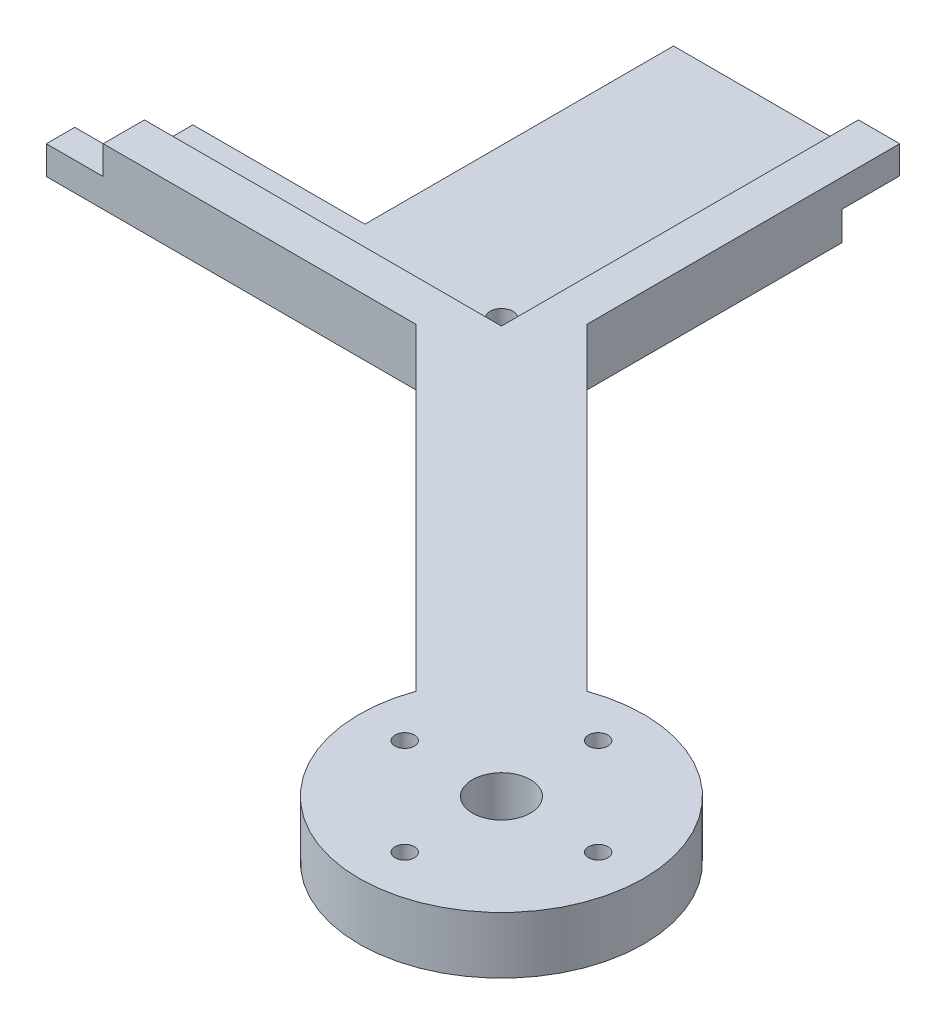
ISO-10303-21;
HEADER;
FILE_DESCRIPTION(('STEP AP214'),'2;1');
FILE_NAME('part.step','',(''),(''),'','','');
FILE_SCHEMA(('AUTOMOTIVE_DESIGN { 1 0 10303 214 1 1 1 1 }'));
ENDSEC;
DATA;
#1=APPLICATION_CONTEXT('core data for automotive mechanical design processes');
#2=APPLICATION_PROTOCOL_DEFINITION('international standard','automotive_design',2000,#1);
#3=PRODUCT_CONTEXT('',#1,'mechanical');
#4=PRODUCT('Part','Part','',(#3));
#5=PRODUCT_RELATED_PRODUCT_CATEGORY('part','',(#4));
#6=PRODUCT_DEFINITION_FORMATION('','',#4);
#7=PRODUCT_DEFINITION_CONTEXT('part definition',#1,'design');
#8=PRODUCT_DEFINITION('design','',#6,#7);
#9=PRODUCT_DEFINITION_SHAPE('','',#8);
#10=(LENGTH_UNIT() NAMED_UNIT(*) SI_UNIT(.MILLI.,.METRE.));
#11=(NAMED_UNIT(*) PLANE_ANGLE_UNIT() SI_UNIT($,.RADIAN.));
#12=(NAMED_UNIT(*) SI_UNIT($,.STERADIAN.) SOLID_ANGLE_UNIT());
#13=UNCERTAINTY_MEASURE_WITH_UNIT(LENGTH_MEASURE(1.E-05),#10,'distance_accuracy_value','');
#14=(GEOMETRIC_REPRESENTATION_CONTEXT(3) GLOBAL_UNCERTAINTY_ASSIGNED_CONTEXT((#13)) GLOBAL_UNIT_ASSIGNED_CONTEXT((#10,
#11,#12)) REPRESENTATION_CONTEXT('',''));
#15=CARTESIAN_POINT('',(0.,0.,0.));
#16=DIRECTION('',(0.,0.,1.));
#17=DIRECTION('',(1.,0.,0.));
#18=AXIS2_PLACEMENT_3D('',#15,#16,#17);
#19=CARTESIAN_POINT('',(-70.,-10.01,0.));
#20=DIRECTION('',(0.,0.,1.));
#21=DIRECTION('',(1.,0.,0.));
#22=AXIS2_PLACEMENT_3D('',#19,#20,#21);
#23=PLANE('',#22);
#24=DIRECTION('',(0.,-1.,0.));
#25=VECTOR('',#24,1.);
#26=CARTESIAN_POINT('',(70.,-10.,0.));
#27=LINE('',#26,#25);
#28=CARTESIAN_POINT('',(70.,0.,0.));
#29=VERTEX_POINT('',#28);
#30=CARTESIAN_POINT('',(70.,-4.9,0.));
#31=VERTEX_POINT('',#30);
#32=EDGE_CURVE('E326',#29,#31,#27,.T.);
#33=ORIENTED_EDGE('',*,*,#32,.T.);
#34=DIRECTION('',(1.,0.,0.));
#35=VECTOR('',#34,1.);
#36=CARTESIAN_POINT('',(70.,-4.9,0.));
#37=LINE('',#36,#35);
#38=CARTESIAN_POINT('',(64.9,-4.9,0.));
#39=VERTEX_POINT('',#38);
#40=EDGE_CURVE('E196',#39,#31,#37,.T.);
#41=ORIENTED_EDGE('',*,*,#40,.F.);
#42=DIRECTION('',(0.,1.,0.));
#43=VECTOR('',#42,1.);
#44=CARTESIAN_POINT('',(64.9,-10.,0.));
#45=LINE('',#44,#43);
#46=CARTESIAN_POINT('',(64.9,-10.,0.));
#47=VERTEX_POINT('',#46);
#48=EDGE_CURVE('E409',#47,#39,#45,.T.);
#49=ORIENTED_EDGE('',*,*,#48,.F.);
#50=DIRECTION('',(1.,0.,0.));
#51=VECTOR('',#50,1.);
#52=CARTESIAN_POINT('',(134.350288425444,-10.,0.));
#53=LINE('',#52,#51);
#54=CARTESIAN_POINT('',(40.35,-10.,0.));
#55=VERTEX_POINT('',#54);
#56=EDGE_CURVE('E337',#55,#47,#53,.T.);
#57=ORIENTED_EDGE('',*,*,#56,.F.);
#58=DIRECTION('',(0.,-1.,0.));
#59=VECTOR('',#58,1.);
#60=CARTESIAN_POINT('',(40.35,-10.,0.));
#61=LINE('',#60,#59);
#62=CARTESIAN_POINT('',(40.35,-7.4,0.));
#63=VERTEX_POINT('',#62);
#64=EDGE_CURVE('E430',#63,#55,#61,.T.);
#65=ORIENTED_EDGE('',*,*,#64,.F.);
#66=DIRECTION('',(1.,0.,0.));
#67=VECTOR('',#66,1.);
#68=CARTESIAN_POINT('',(30.25,-7.4,0.));
#69=LINE('',#68,#67);
#70=CARTESIAN_POINT('',(30.25,-7.4,0.));
#71=VERTEX_POINT('',#70);
#72=EDGE_CURVE('E440',#71,#63,#69,.T.);
#73=ORIENTED_EDGE('',*,*,#72,.F.);
#74=DIRECTION('',(0.,-1.,0.));
#75=VECTOR('',#74,1.);
#76=CARTESIAN_POINT('',(30.25,-10.,0.));
#77=LINE('',#76,#75);
#78=CARTESIAN_POINT('',(30.25,-5.,0.));
#79=VERTEX_POINT('',#78);
#80=EDGE_CURVE('E332',#79,#71,#77,.T.);
#81=ORIENTED_EDGE('',*,*,#80,.F.);
#82=DIRECTION('',(1.,0.,0.));
#83=VECTOR('',#82,1.);
#84=CARTESIAN_POINT('',(0.,-5.,0.));
#85=LINE('',#84,#83);
#86=CARTESIAN_POINT('',(62.75,-5.,0.));
#87=VERTEX_POINT('',#86);
#88=EDGE_CURVE('E43',#79,#87,#85,.T.);
#89=ORIENTED_EDGE('',*,*,#88,.T.);
#90=DIRECTION('',(0.,-1.,0.));
#91=VECTOR('',#90,1.);
#92=CARTESIAN_POINT('',(62.75,-5.,0.));
#93=LINE('',#92,#91);
#94=CARTESIAN_POINT('',(62.75,0.,0.));
#95=VERTEX_POINT('',#94);
#96=EDGE_CURVE('E345',#95,#87,#93,.T.);
#97=ORIENTED_EDGE('',*,*,#96,.F.);
#98=DIRECTION('',(1.,0.,0.));
#99=VECTOR('',#98,1.);
#100=CARTESIAN_POINT('',(134.350288425444,0.,0.));
#101=LINE('',#100,#99);
#102=EDGE_CURVE('E327',#95,#29,#101,.T.);
#103=ORIENTED_EDGE('',*,*,#102,.T.);
#104=EDGE_LOOP('',(#33,#41,#49,#57,#65,#73,#81,#89,#97,#103));
#105=FACE_BOUND('',#104,.T.);
#106=ADVANCED_FACE('F39',(#105),#23,.F.);
#107=CARTESIAN_POINT('',(0.,-10.01,-70.));
#108=DIRECTION('',(-1.,0.,0.));
#109=DIRECTION('',(0.,0.,1.));
#110=AXIS2_PLACEMENT_3D('',#107,#108,#109);
#111=PLANE('',#110);
#112=DIRECTION('',(0.,-1.,0.));
#113=VECTOR('',#112,1.);
#114=CARTESIAN_POINT('',(0.,-10.,65.));
#115=LINE('',#114,#113);
#116=CARTESIAN_POINT('',(0.,-5.,65.));
#117=VERTEX_POINT('',#116);
#118=CARTESIAN_POINT('',(0.,-10.,65.));
#119=VERTEX_POINT('',#118);
#120=EDGE_CURVE('E459',#117,#119,#115,.T.);
#121=ORIENTED_EDGE('',*,*,#120,.F.);
#122=DIRECTION('',(0.,0.,-1.));
#123=VECTOR('',#122,1.);
#124=CARTESIAN_POINT('',(0.,-5.,70.));
#125=LINE('',#124,#123);
#126=CARTESIAN_POINT('',(0.,-5.,70.));
#127=VERTEX_POINT('',#126);
#128=EDGE_CURVE('E420',#127,#117,#125,.T.);
#129=ORIENTED_EDGE('',*,*,#128,.F.);
#130=DIRECTION('',(0.,-1.,0.));
#131=VECTOR('',#130,1.);
#132=CARTESIAN_POINT('',(0.,-10.,70.));
#133=LINE('',#132,#131);
#134=CARTESIAN_POINT('',(0.,0.,70.));
#135=VERTEX_POINT('',#134);
#136=EDGE_CURVE('E333',#135,#127,#133,.T.);
#137=ORIENTED_EDGE('',*,*,#136,.F.);
#138=DIRECTION('',(0.,0.,1.));
#139=VECTOR('',#138,1.);
#140=CARTESIAN_POINT('',(0.,0.,-134.350288425444));
#141=LINE('',#140,#139);
#142=CARTESIAN_POINT('',(0.,0.,62.75));
#143=VERTEX_POINT('',#142);
#144=EDGE_CURVE('E338',#143,#135,#141,.T.);
#145=ORIENTED_EDGE('',*,*,#144,.F.);
#146=DIRECTION('',(0.,-1.,0.));
#147=VECTOR('',#146,1.);
#148=CARTESIAN_POINT('',(0.,-5.,62.75));
#149=LINE('',#148,#147);
#150=CARTESIAN_POINT('',(0.,-5.,62.75));
#151=VERTEX_POINT('',#150);
#152=EDGE_CURVE('E318',#143,#151,#149,.T.);
#153=ORIENTED_EDGE('',*,*,#152,.T.);
#154=DIRECTION('',(0.,0.,1.));
#155=VECTOR('',#154,1.);
#156=CARTESIAN_POINT('',(0.,-5.,0.));
#157=LINE('',#156,#155);
#158=CARTESIAN_POINT('',(0.,-5.,54.25));
#159=VERTEX_POINT('',#158);
#160=EDGE_CURVE('E341',#159,#151,#157,.T.);
#161=ORIENTED_EDGE('',*,*,#160,.F.);
#162=DIRECTION('',(0.,-1.,0.));
#163=VECTOR('',#162,1.);
#164=CARTESIAN_POINT('',(0.,-10.,54.25));
#165=LINE('',#164,#163);
#166=CARTESIAN_POINT('',(0.,-10.,54.25));
#167=VERTEX_POINT('',#166);
#168=EDGE_CURVE('E328',#159,#167,#165,.T.);
#169=ORIENTED_EDGE('',*,*,#168,.T.);
#170=DIRECTION('',(0.,0.,1.));
#171=VECTOR('',#170,1.);
#172=CARTESIAN_POINT('',(0.,-10.,-134.350288425444));
#173=LINE('',#172,#171);
#174=EDGE_CURVE('E323',#167,#119,#173,.T.);
#175=ORIENTED_EDGE('',*,*,#174,.T.);
#176=EDGE_LOOP('',(#121,#129,#137,#145,#153,#161,#169,#175));
#177=FACE_BOUND('',#176,.T.);
#178=ADVANCED_FACE('F504',(#177),#111,.T.);
#179=CARTESIAN_POINT('',(-30.25,-10.,54.25));
#180=DIRECTION('',(0.,0.,1.));
#181=DIRECTION('',(1.,0.,0.));
#182=AXIS2_PLACEMENT_3D('',#179,#180,#181);
#183=PLANE('',#182);
#184=ORIENTED_EDGE('',*,*,#168,.F.);
#185=DIRECTION('',(-1.,0.,0.));
#186=VECTOR('',#185,1.);
#187=CARTESIAN_POINT('',(-30.25,-5.,54.25));
#188=LINE('',#187,#186);
#189=CARTESIAN_POINT('',(30.25,-5.,54.25));
#190=VERTEX_POINT('',#189);
#191=EDGE_CURVE('E295',#190,#159,#188,.T.);
#192=ORIENTED_EDGE('',*,*,#191,.F.);
#193=DIRECTION('',(0.,1.,0.));
#194=VECTOR('',#193,1.);
#195=CARTESIAN_POINT('',(30.25,-10.,54.25));
#196=LINE('',#195,#194);
#197=CARTESIAN_POINT('',(30.25,-10.,54.25));
#198=VERTEX_POINT('',#197);
#199=EDGE_CURVE('E235',#198,#190,#196,.T.);
#200=ORIENTED_EDGE('',*,*,#199,.F.);
#201=DIRECTION('',(1.,0.,0.));
#202=VECTOR('',#201,1.);
#203=CARTESIAN_POINT('',(-30.25,-10.,54.25));
#204=LINE('',#203,#202);
#205=EDGE_CURVE('E239',#167,#198,#204,.T.);
#206=ORIENTED_EDGE('',*,*,#205,.F.);
#207=EDGE_LOOP('',(#184,#192,#200,#206));
#208=FACE_BOUND('',#207,.T.);
#209=ADVANCED_FACE('F501',(#208),#183,.F.);
#210=CARTESIAN_POINT('',(-55.,-10.,70.));
#211=DIRECTION('',(0.,0.,1.));
#212=DIRECTION('',(1.,0.,0.));
#213=AXIS2_PLACEMENT_3D('',#210,#211,#212);
#214=PLANE('',#213);
#215=DIRECTION('',(1.,0.,0.));
#216=VECTOR('',#215,1.);
#217=CARTESIAN_POINT('',(-55.,0.,70.));
#218=LINE('',#217,#216);
#219=CARTESIAN_POINT('',(55.,0.,70.));
#220=VERTEX_POINT('',#219);
#221=EDGE_CURVE('E240',#135,#220,#218,.T.);
#222=ORIENTED_EDGE('',*,*,#221,.F.);
#223=ORIENTED_EDGE('',*,*,#136,.T.);
#224=DIRECTION('',(1.,0.,0.));
#225=VECTOR('',#224,1.);
#226=CARTESIAN_POINT('',(-10.,-5.,70.));
#227=LINE('',#226,#225);
#228=CARTESIAN_POINT('',(-10.,-5.,70.));
#229=VERTEX_POINT('',#228);
#230=EDGE_CURVE('E322',#229,#127,#227,.T.);
#231=ORIENTED_EDGE('',*,*,#230,.F.);
#232=DIRECTION('',(0.,1.,0.));
#233=VECTOR('',#232,1.);
#234=CARTESIAN_POINT('',(-10.,-10.,70.));
#235=LINE('',#234,#233);
#236=CARTESIAN_POINT('',(-10.,-10.,70.));
#237=VERTEX_POINT('',#236);
#238=EDGE_CURVE('E454',#237,#229,#235,.T.);
#239=ORIENTED_EDGE('',*,*,#238,.F.);
#240=DIRECTION('',(1.,0.,0.));
#241=VECTOR('',#240,1.);
#242=CARTESIAN_POINT('',(-55.,-10.,70.));
#243=LINE('',#242,#241);
#244=CARTESIAN_POINT('',(55.,-10.,70.));
#245=VERTEX_POINT('',#244);
#246=EDGE_CURVE('E234',#237,#245,#243,.T.);
#247=ORIENTED_EDGE('',*,*,#246,.T.);
#248=DIRECTION('',(0.,1.,0.));
#249=VECTOR('',#248,1.);
#250=CARTESIAN_POINT('',(55.,-10.,70.));
#251=LINE('',#250,#249);
#252=EDGE_CURVE('E214',#245,#220,#251,.T.);
#253=ORIENTED_EDGE('',*,*,#252,.T.);
#254=EDGE_LOOP('',(#222,#223,#231,#239,#247,#253));
#255=FACE_BOUND('',#254,.T.);
#256=ADVANCED_FACE('F517',(#255),#214,.T.);
#257=CARTESIAN_POINT('',(134.350288425444,-10.,-134.350288425444));
#258=DIRECTION('',(0.,1.,0.));
#259=DIRECTION('',(0.,0.,1.));
#260=AXIS2_PLACEMENT_3D('',#257,#258,#259);
#261=PLANE('',#260);
#262=CARTESIAN_POINT('',(56.4999999999999,-10.,56.5));
#263=DIRECTION('',(0.,1.,0.));
#264=DIRECTION('',(0.,0.,1.));
#265=AXIS2_PLACEMENT_3D('',#262,#263,#264);
#266=CIRCLE('',#265,2.00000000000045);
#267=CARTESIAN_POINT('',(56.4999999999999,-10.,58.5000000000004));
#268=VERTEX_POINT('',#267);
#269=EDGE_CURVE('E245',#268,#268,#266,.T.);
#270=ORIENTED_EDGE('',*,*,#269,.T.);
#271=EDGE_LOOP('',(#270));
#272=FACE_BOUND('',#271,.T.);
#273=CARTESIAN_POINT('',(117.350288425444,-10.,134.350288425444));
#274=DIRECTION('',(0.,1.,0.));
#275=DIRECTION('',(0.,0.,1.));
#276=AXIS2_PLACEMENT_3D('',#273,#274,#275);
#277=CIRCLE('',#276,1.7);
#278=CARTESIAN_POINT('',(117.350288425444,-10.,136.050288425444));
#279=VERTEX_POINT('',#278);
#280=EDGE_CURVE('E249',#279,#279,#277,.T.);
#281=ORIENTED_EDGE('',*,*,#280,.T.);
#282=EDGE_LOOP('',(#281));
#283=FACE_BOUND('',#282,.T.);
#284=CARTESIAN_POINT('',(134.350288425444,-10.,117.350288425444));
#285=DIRECTION('',(0.,1.,0.));
#286=DIRECTION('',(0.,0.,1.));
#287=AXIS2_PLACEMENT_3D('',#284,#285,#286);
#288=CIRCLE('',#287,1.70000000000001);
#289=CARTESIAN_POINT('',(134.350288425444,-10.,119.050288425444));
#290=VERTEX_POINT('',#289);
#291=EDGE_CURVE('E254',#290,#290,#288,.T.);
#292=ORIENTED_EDGE('',*,*,#291,.T.);
#293=EDGE_LOOP('',(#292));
#294=FACE_BOUND('',#293,.T.);
#295=CARTESIAN_POINT('',(134.350288425444,-10.,151.350288425444));
#296=DIRECTION('',(0.,1.,0.));
#297=DIRECTION('',(0.,0.,1.));
#298=AXIS2_PLACEMENT_3D('',#295,#296,#297);
#299=CIRCLE('',#298,1.70000000000001);
#300=CARTESIAN_POINT('',(134.350288425444,-10.,153.050288425444));
#301=VERTEX_POINT('',#300);
#302=EDGE_CURVE('E262',#301,#301,#299,.T.);
#303=ORIENTED_EDGE('',*,*,#302,.T.);
#304=EDGE_LOOP('',(#303));
#305=FACE_BOUND('',#304,.T.);
#306=CARTESIAN_POINT('',(151.350288425444,-10.,134.350288425444));
#307=DIRECTION('',(0.,1.,0.));
#308=DIRECTION('',(0.,0.,1.));
#309=AXIS2_PLACEMENT_3D('',#306,#307,#308);
#310=CIRCLE('',#309,1.70000000000001);
#311=CARTESIAN_POINT('',(151.350288425444,-10.,136.050288425444));
#312=VERTEX_POINT('',#311);
#313=EDGE_CURVE('E270',#312,#312,#310,.T.);
#314=ORIENTED_EDGE('',*,*,#313,.T.);
#315=EDGE_LOOP('',(#314));
#316=FACE_BOUND('',#315,.T.);
#317=CARTESIAN_POINT('',(134.350288425444,-10.,134.350288425444));
#318=DIRECTION('',(0.,1.,0.));
#319=DIRECTION('',(0.,0.,1.));
#320=AXIS2_PLACEMENT_3D('',#317,#318,#319);
#321=CIRCLE('',#320,5.09999999999998);
#322=CARTESIAN_POINT('',(134.350288425444,-10.,139.450288425444));
#323=VERTEX_POINT('',#322);
#324=EDGE_CURVE('E278',#323,#323,#321,.T.);
#325=ORIENTED_EDGE('',*,*,#324,.T.);
#326=EDGE_LOOP('',(#325));
#327=FACE_BOUND('',#326,.T.);
#328=ORIENTED_EDGE('',*,*,#56,.T.);
#329=DIRECTION('',(0.,0.,-1.));
#330=VECTOR('',#329,1.);
#331=CARTESIAN_POINT('',(64.9,-10.,10.1));
#332=LINE('',#331,#330);
#333=CARTESIAN_POINT('',(64.9,-10.,10.1));
#334=VERTEX_POINT('',#333);
#335=EDGE_CURVE('E205',#334,#47,#332,.T.);
#336=ORIENTED_EDGE('',*,*,#335,.F.);
#337=DIRECTION('',(-1.,0.,0.));
#338=VECTOR('',#337,1.);
#339=CARTESIAN_POINT('',(70.,-10.,10.1));
#340=LINE('',#339,#338);
#341=CARTESIAN_POINT('',(70.,-10.,10.1));
#342=VERTEX_POINT('',#341);
#343=EDGE_CURVE('E190',#342,#334,#340,.T.);
#344=ORIENTED_EDGE('',*,*,#343,.F.);
#345=DIRECTION('',(0.,0.,-1.));
#346=VECTOR('',#345,1.);
#347=CARTESIAN_POINT('',(70.,-10.,-55.));
#348=LINE('',#347,#346);
#349=CARTESIAN_POINT('',(70.,-10.,55.));
#350=VERTEX_POINT('',#349);
#351=EDGE_CURVE('E203',#350,#342,#348,.T.);
#352=ORIENTED_EDGE('',*,*,#351,.F.);
#353=DIRECTION('',(-0.707106781186547,0.,-0.707106781186548));
#354=VECTOR('',#353,1.);
#355=CARTESIAN_POINT('',(70.,-10.,55.));
#356=LINE('',#355,#354);
#357=CARTESIAN_POINT('',(125.842477831862,-10.,110.842477831862));
#358=VERTEX_POINT('',#357);
#359=EDGE_CURVE('E213',#358,#350,#356,.T.);
#360=ORIENTED_EDGE('',*,*,#359,.F.);
#361=CARTESIAN_POINT('',(134.350288425444,-10.,134.350288425444));
#362=DIRECTION('',(0.,1.,0.));
#363=DIRECTION('',(0.,0.,1.));
#364=AXIS2_PLACEMENT_3D('',#361,#362,#363);
#365=CIRCLE('',#364,25.);
#366=CARTESIAN_POINT('',(110.842477831862,-10.,125.842477831862));
#367=VERTEX_POINT('',#366);
#368=EDGE_CURVE('E218',#367,#358,#365,.T.);
#369=ORIENTED_EDGE('',*,*,#368,.F.);
#370=DIRECTION('',(0.707106781186547,0.,0.707106781186547));
#371=VECTOR('',#370,1.);
#372=CARTESIAN_POINT('',(55.,-10.,70.));
#373=LINE('',#372,#371);
#374=EDGE_CURVE('E230',#245,#367,#373,.T.);
#375=ORIENTED_EDGE('',*,*,#374,.F.);
#376=ORIENTED_EDGE('',*,*,#246,.F.);
#377=DIRECTION('',(0.,0.,1.));
#378=VECTOR('',#377,1.);
#379=CARTESIAN_POINT('',(-10.,-10.,70.));
#380=LINE('',#379,#378);
#381=CARTESIAN_POINT('',(-10.,-10.,65.));
#382=VERTEX_POINT('',#381);
#383=EDGE_CURVE('E465',#382,#237,#380,.T.);
#384=ORIENTED_EDGE('',*,*,#383,.F.);
#385=DIRECTION('',(1.,0.,0.));
#386=VECTOR('',#385,1.);
#387=CARTESIAN_POINT('',(-10.,-10.,65.));
#388=LINE('',#387,#386);
#389=EDGE_CURVE('E469',#382,#119,#388,.T.);
#390=ORIENTED_EDGE('',*,*,#389,.T.);
#391=ORIENTED_EDGE('',*,*,#174,.F.);
#392=ORIENTED_EDGE('',*,*,#205,.T.);
#393=DIRECTION('',(0.,0.,-1.));
#394=VECTOR('',#393,1.);
#395=CARTESIAN_POINT('',(30.25,-10.,-54.25));
#396=LINE('',#395,#394);
#397=CARTESIAN_POINT('',(30.25,-10.,10.1));
#398=VERTEX_POINT('',#397);
#399=EDGE_CURVE('E241',#198,#398,#396,.T.);
#400=ORIENTED_EDGE('',*,*,#399,.T.);
#401=DIRECTION('',(-1.,0.,0.));
#402=VECTOR('',#401,1.);
#403=CARTESIAN_POINT('',(30.25,-10.,10.1));
#404=LINE('',#403,#402);
#405=CARTESIAN_POINT('',(40.35,-10.,10.1));
#406=VERTEX_POINT('',#405);
#407=EDGE_CURVE('E57',#406,#398,#404,.T.);
#408=ORIENTED_EDGE('',*,*,#407,.F.);
#409=DIRECTION('',(0.,0.,-1.));
#410=VECTOR('',#409,1.);
#411=CARTESIAN_POINT('',(40.35,-10.,10.1));
#412=LINE('',#411,#410);
#413=EDGE_CURVE('E414',#406,#55,#412,.T.);
#414=ORIENTED_EDGE('',*,*,#413,.T.);
#415=EDGE_LOOP('',(#328,#336,#344,#352,#360,#369,#375,#376,#384,#390,#391,#392,#400,#408,#414));
#416=FACE_BOUND('',#415,.T.);
#417=ADVANCED_FACE('F201',(#272,#283,#294,#305,#316,#327,#416),#261,.F.);
#418=CARTESIAN_POINT('',(134.350288425444,0.,-134.350288425444));
#419=DIRECTION('',(0.,1.,0.));
#420=DIRECTION('',(0.,0.,1.));
#421=AXIS2_PLACEMENT_3D('',#418,#419,#420);
#422=PLANE('',#421);
#423=CARTESIAN_POINT('',(117.350288425444,0.,134.350288425444));
#424=DIRECTION('',(0.,1.,0.));
#425=DIRECTION('',(0.,0.,1.));
#426=AXIS2_PLACEMENT_3D('',#423,#424,#425);
#427=CIRCLE('',#426,1.7);
#428=CARTESIAN_POINT('',(117.350288425444,0.,136.050288425444));
#429=VERTEX_POINT('',#428);
#430=EDGE_CURVE('E250',#429,#429,#427,.T.);
#431=ORIENTED_EDGE('',*,*,#430,.F.);
#432=EDGE_LOOP('',(#431));
#433=FACE_BOUND('',#432,.T.);
#434=CARTESIAN_POINT('',(134.350288425444,0.,117.350288425444));
#435=DIRECTION('',(0.,1.,0.));
#436=DIRECTION('',(0.,0.,1.));
#437=AXIS2_PLACEMENT_3D('',#434,#435,#436);
#438=CIRCLE('',#437,1.70000000000001);
#439=CARTESIAN_POINT('',(134.350288425444,0.,119.050288425444));
#440=VERTEX_POINT('',#439);
#441=EDGE_CURVE('E258',#440,#440,#438,.T.);
#442=ORIENTED_EDGE('',*,*,#441,.F.);
#443=EDGE_LOOP('',(#442));
#444=FACE_BOUND('',#443,.T.);
#445=CARTESIAN_POINT('',(134.350288425444,0.,151.350288425444));
#446=DIRECTION('',(0.,1.,0.));
#447=DIRECTION('',(0.,0.,1.));
#448=AXIS2_PLACEMENT_3D('',#445,#446,#447);
#449=CIRCLE('',#448,1.70000000000001);
#450=CARTESIAN_POINT('',(134.350288425444,0.,153.050288425444));
#451=VERTEX_POINT('',#450);
#452=EDGE_CURVE('E266',#451,#451,#449,.T.);
#453=ORIENTED_EDGE('',*,*,#452,.F.);
#454=EDGE_LOOP('',(#453));
#455=FACE_BOUND('',#454,.T.);
#456=CARTESIAN_POINT('',(151.350288425444,0.,134.350288425444));
#457=DIRECTION('',(0.,1.,0.));
#458=DIRECTION('',(0.,0.,1.));
#459=AXIS2_PLACEMENT_3D('',#456,#457,#458);
#460=CIRCLE('',#459,1.70000000000001);
#461=CARTESIAN_POINT('',(151.350288425444,0.,136.050288425444));
#462=VERTEX_POINT('',#461);
#463=EDGE_CURVE('E274',#462,#462,#460,.T.);
#464=ORIENTED_EDGE('',*,*,#463,.F.);
#465=EDGE_LOOP('',(#464));
#466=FACE_BOUND('',#465,.T.);
#467=CARTESIAN_POINT('',(134.350288425444,0.,134.350288425444));
#468=DIRECTION('',(0.,1.,0.));
#469=DIRECTION('',(0.,0.,1.));
#470=AXIS2_PLACEMENT_3D('',#467,#468,#469);
#471=CIRCLE('',#470,5.09999999999998);
#472=CARTESIAN_POINT('',(134.350288425444,0.,139.450288425444));
#473=VERTEX_POINT('',#472);
#474=EDGE_CURVE('E282',#473,#473,#471,.T.);
#475=ORIENTED_EDGE('',*,*,#474,.F.);
#476=EDGE_LOOP('',(#475));
#477=FACE_BOUND('',#476,.T.);
#478=DIRECTION('',(1.,0.,0.));
#479=VECTOR('',#478,1.);
#480=CARTESIAN_POINT('',(-62.75,0.,62.75));
#481=LINE('',#480,#479);
#482=CARTESIAN_POINT('',(62.75,0.,62.75));
#483=VERTEX_POINT('',#482);
#484=EDGE_CURVE('E49',#143,#483,#481,.T.);
#485=ORIENTED_EDGE('',*,*,#484,.F.);
#486=ORIENTED_EDGE('',*,*,#144,.T.);
#487=ORIENTED_EDGE('',*,*,#221,.T.);
#488=DIRECTION('',(0.707106781186547,0.,0.707106781186547));
#489=VECTOR('',#488,1.);
#490=CARTESIAN_POINT('',(55.,0.,70.));
#491=LINE('',#490,#489);
#492=CARTESIAN_POINT('',(110.842477831862,0.,125.842477831862));
#493=VERTEX_POINT('',#492);
#494=EDGE_CURVE('E224',#220,#493,#491,.T.);
#495=ORIENTED_EDGE('',*,*,#494,.T.);
#496=CARTESIAN_POINT('',(134.350288425444,0.,134.350288425444));
#497=DIRECTION('',(0.,1.,0.));
#498=DIRECTION('',(0.,0.,1.));
#499=AXIS2_PLACEMENT_3D('',#496,#497,#498);
#500=CIRCLE('',#499,25.);
#501=CARTESIAN_POINT('',(125.842477831862,0.,110.842477831862));
#502=VERTEX_POINT('',#501);
#503=EDGE_CURVE('E384',#493,#502,#500,.T.);
#504=ORIENTED_EDGE('',*,*,#503,.T.);
#505=DIRECTION('',(-0.707106781186547,0.,-0.707106781186548));
#506=VECTOR('',#505,1.);
#507=CARTESIAN_POINT('',(70.,0.,55.));
#508=LINE('',#507,#506);
#509=CARTESIAN_POINT('',(70.,0.,55.));
#510=VERTEX_POINT('',#509);
#511=EDGE_CURVE('E381',#502,#510,#508,.T.);
#512=ORIENTED_EDGE('',*,*,#511,.T.);
#513=DIRECTION('',(0.,0.,-1.));
#514=VECTOR('',#513,1.);
#515=CARTESIAN_POINT('',(70.,0.,-55.));
#516=LINE('',#515,#514);
#517=EDGE_CURVE('E317',#510,#29,#516,.T.);
#518=ORIENTED_EDGE('',*,*,#517,.T.);
#519=ORIENTED_EDGE('',*,*,#102,.F.);
#520=DIRECTION('',(0.,0.,-1.));
#521=VECTOR('',#520,1.);
#522=CARTESIAN_POINT('',(62.75,0.,-62.75));
#523=LINE('',#522,#521);
#524=EDGE_CURVE('E11',#483,#95,#523,.T.);
#525=ORIENTED_EDGE('',*,*,#524,.F.);
#526=EDGE_LOOP('',(#485,#486,#487,#495,#504,#512,#518,#519,#525));
#527=FACE_BOUND('',#526,.T.);
#528=ADVANCED_FACE('F392',(#433,#444,#455,#466,#477,#527),#422,.T.);
#529=CARTESIAN_POINT('',(0.,-5.,0.));
#530=DIRECTION('',(0.,1.,0.));
#531=DIRECTION('',(0.,0.,1.));
#532=AXIS2_PLACEMENT_3D('',#529,#530,#531);
#533=PLANE('',#532);
#534=CARTESIAN_POINT('',(56.4999999999999,-5.,56.5));
#535=DIRECTION('',(0.,1.,0.));
#536=DIRECTION('',(0.,0.,1.));
#537=AXIS2_PLACEMENT_3D('',#534,#535,#536);
#538=CIRCLE('',#537,2.00000000000045);
#539=CARTESIAN_POINT('',(56.4999999999999,-5.,58.5000000000004));
#540=VERTEX_POINT('',#539);
#541=EDGE_CURVE('E290',#540,#540,#538,.F.);
#542=ORIENTED_EDGE('',*,*,#541,.T.);
#543=EDGE_LOOP('',(#542));
#544=FACE_BOUND('',#543,.T.);
#545=ORIENTED_EDGE('',*,*,#191,.T.);
#546=ORIENTED_EDGE('',*,*,#160,.T.);
#547=DIRECTION('',(1.,0.,0.));
#548=VECTOR('',#547,1.);
#549=CARTESIAN_POINT('',(-62.75,-5.,62.75));
#550=LINE('',#549,#548);
#551=CARTESIAN_POINT('',(62.75,-5.,62.75));
#552=VERTEX_POINT('',#551);
#553=EDGE_CURVE('E298',#151,#552,#550,.T.);
#554=ORIENTED_EDGE('',*,*,#553,.T.);
#555=DIRECTION('',(0.,0.,-1.));
#556=VECTOR('',#555,1.);
#557=CARTESIAN_POINT('',(62.75,-5.,-62.75));
#558=LINE('',#557,#556);
#559=EDGE_CURVE('E300',#552,#87,#558,.T.);
#560=ORIENTED_EDGE('',*,*,#559,.T.);
#561=ORIENTED_EDGE('',*,*,#88,.F.);
#562=DIRECTION('',(0.,0.,1.));
#563=VECTOR('',#562,1.);
#564=CARTESIAN_POINT('',(30.25,-5.,-54.25));
#565=LINE('',#564,#563);
#566=EDGE_CURVE('E286',#79,#190,#565,.T.);
#567=ORIENTED_EDGE('',*,*,#566,.T.);
#568=EDGE_LOOP('',(#545,#546,#554,#560,#561,#567));
#569=FACE_BOUND('',#568,.T.);
#570=ADVANCED_FACE('F41',(#544,#569),#533,.T.);
#571=CARTESIAN_POINT('',(-62.75,-5.,62.75));
#572=DIRECTION('',(0.,0.,1.));
#573=DIRECTION('',(1.,0.,0.));
#574=AXIS2_PLACEMENT_3D('',#571,#572,#573);
#575=PLANE('',#574);
#576=ORIENTED_EDGE('',*,*,#152,.F.);
#577=ORIENTED_EDGE('',*,*,#484,.T.);
#578=DIRECTION('',(0.,1.,0.));
#579=VECTOR('',#578,1.);
#580=CARTESIAN_POINT('',(62.75,-5.,62.75));
#581=LINE('',#580,#579);
#582=EDGE_CURVE('E294',#552,#483,#581,.T.);
#583=ORIENTED_EDGE('',*,*,#582,.F.);
#584=ORIENTED_EDGE('',*,*,#553,.F.);
#585=EDGE_LOOP('',(#576,#577,#583,#584));
#586=FACE_BOUND('',#585,.T.);
#587=ADVANCED_FACE('F521',(#586),#575,.F.);
#588=CARTESIAN_POINT('',(30.25,-10.,-54.25));
#589=DIRECTION('',(1.,0.,0.));
#590=DIRECTION('',(0.,0.,-1.));
#591=AXIS2_PLACEMENT_3D('',#588,#589,#590);
#592=PLANE('',#591);
#593=ORIENTED_EDGE('',*,*,#80,.T.);
#594=DIRECTION('',(0.,0.,-1.));
#595=VECTOR('',#594,1.);
#596=CARTESIAN_POINT('',(30.25,-7.4,10.1));
#597=LINE('',#596,#595);
#598=CARTESIAN_POINT('',(30.25,-7.4,10.1));
#599=VERTEX_POINT('',#598);
#600=EDGE_CURVE('E439',#599,#71,#597,.T.);
#601=ORIENTED_EDGE('',*,*,#600,.F.);
#602=DIRECTION('',(0.,1.,0.));
#603=VECTOR('',#602,1.);
#604=CARTESIAN_POINT('',(30.25,-10.,10.1));
#605=LINE('',#604,#603);
#606=EDGE_CURVE('E426',#398,#599,#605,.T.);
#607=ORIENTED_EDGE('',*,*,#606,.F.);
#608=ORIENTED_EDGE('',*,*,#399,.F.);
#609=ORIENTED_EDGE('',*,*,#199,.T.);
#610=ORIENTED_EDGE('',*,*,#566,.F.);
#611=EDGE_LOOP('',(#593,#601,#607,#608,#609,#610));
#612=FACE_BOUND('',#611,.T.);
#613=ADVANCED_FACE('F494',(#612),#592,.F.);
#614=CARTESIAN_POINT('',(56.4999999999999,-10.,56.5));
#615=DIRECTION('',(0.,1.,0.));
#616=DIRECTION('',(0.,0.,1.));
#617=AXIS2_PLACEMENT_3D('',#614,#615,#616);
#618=CYLINDRICAL_SURFACE('',#617,2.00000000000045);
#619=ORIENTED_EDGE('',*,*,#269,.F.);
#620=EDGE_LOOP('',(#619));
#621=FACE_BOUND('',#620,.T.);
#622=ORIENTED_EDGE('',*,*,#541,.F.);
#623=EDGE_LOOP('',(#622));
#624=FACE_BOUND('',#623,.T.);
#625=ADVANCED_FACE('F529',(#621,#624),#618,.F.);
#626=CARTESIAN_POINT('',(70.,-10.,-55.));
#627=DIRECTION('',(1.,0.,0.));
#628=DIRECTION('',(0.,0.,-1.));
#629=AXIS2_PLACEMENT_3D('',#626,#627,#628);
#630=PLANE('',#629);
#631=DIRECTION('',(0.,0.,-1.));
#632=VECTOR('',#631,1.);
#633=CARTESIAN_POINT('',(70.,-4.9,10.1));
#634=LINE('',#633,#632);
#635=CARTESIAN_POINT('',(70.,-4.9,10.1));
#636=VERTEX_POINT('',#635);
#637=EDGE_CURVE('E404',#636,#31,#634,.T.);
#638=ORIENTED_EDGE('',*,*,#637,.T.);
#639=ORIENTED_EDGE('',*,*,#32,.F.);
#640=ORIENTED_EDGE('',*,*,#517,.F.);
#641=DIRECTION('',(0.,1.,0.));
#642=VECTOR('',#641,1.);
#643=CARTESIAN_POINT('',(70.,-10.,55.));
#644=LINE('',#643,#642);
#645=EDGE_CURVE('E211',#350,#510,#644,.T.);
#646=ORIENTED_EDGE('',*,*,#645,.F.);
#647=ORIENTED_EDGE('',*,*,#351,.T.);
#648=DIRECTION('',(0.,-1.,0.));
#649=VECTOR('',#648,1.);
#650=CARTESIAN_POINT('',(70.,-10.,10.1));
#651=LINE('',#650,#649);
#652=EDGE_CURVE('E187',#636,#342,#651,.T.);
#653=ORIENTED_EDGE('',*,*,#652,.F.);
#654=EDGE_LOOP('',(#638,#639,#640,#646,#647,#653));
#655=FACE_BOUND('',#654,.T.);
#656=ADVANCED_FACE('F209',(#655),#630,.T.);
#657=CARTESIAN_POINT('',(70.,-10.,55.));
#658=DIRECTION('',(0.707106781186548,0.,-0.707106781186547));
#659=DIRECTION('',(-0.707106781186547,0.,-0.707106781186548));
#660=AXIS2_PLACEMENT_3D('',#657,#658,#659);
#661=PLANE('',#660);
#662=ORIENTED_EDGE('',*,*,#511,.F.);
#663=DIRECTION('',(0.,1.,0.));
#664=VECTOR('',#663,1.);
#665=CARTESIAN_POINT('',(125.842477831862,-10.,110.842477831862));
#666=LINE('',#665,#664);
#667=EDGE_CURVE('E370',#358,#502,#666,.T.);
#668=ORIENTED_EDGE('',*,*,#667,.F.);
#669=ORIENTED_EDGE('',*,*,#359,.T.);
#670=ORIENTED_EDGE('',*,*,#645,.T.);
#671=EDGE_LOOP('',(#662,#668,#669,#670));
#672=FACE_BOUND('',#671,.T.);
#673=ADVANCED_FACE('F403',(#672),#661,.T.);
#674=CARTESIAN_POINT('',(134.350288425444,-10.,134.350288425444));
#675=DIRECTION('',(0.,1.,0.));
#676=DIRECTION('',(0.,0.,1.));
#677=AXIS2_PLACEMENT_3D('',#674,#675,#676);
#678=CYLINDRICAL_SURFACE('',#677,25.);
#679=ORIENTED_EDGE('',*,*,#503,.F.);
#680=DIRECTION('',(0.,1.,0.));
#681=VECTOR('',#680,1.);
#682=CARTESIAN_POINT('',(110.842477831862,-10.,125.842477831862));
#683=LINE('',#682,#681);
#684=EDGE_CURVE('E221',#367,#493,#683,.T.);
#685=ORIENTED_EDGE('',*,*,#684,.F.);
#686=ORIENTED_EDGE('',*,*,#368,.T.);
#687=ORIENTED_EDGE('',*,*,#667,.T.);
#688=EDGE_LOOP('',(#679,#685,#686,#687));
#689=FACE_BOUND('',#688,.T.);
#690=ADVANCED_FACE('F400',(#689),#678,.T.);
#691=CARTESIAN_POINT('',(55.,-10.,70.));
#692=DIRECTION('',(-0.707106781186548,0.,0.707106781186548));
#693=DIRECTION('',(0.707106781186548,0.,0.707106781186548));
#694=AXIS2_PLACEMENT_3D('',#691,#692,#693);
#695=PLANE('',#694);
#696=ORIENTED_EDGE('',*,*,#494,.F.);
#697=ORIENTED_EDGE('',*,*,#252,.F.);
#698=ORIENTED_EDGE('',*,*,#374,.T.);
#699=ORIENTED_EDGE('',*,*,#684,.T.);
#700=EDGE_LOOP('',(#696,#697,#698,#699));
#701=FACE_BOUND('',#700,.T.);
#702=ADVANCED_FACE('F396',(#701),#695,.T.);
#703=CARTESIAN_POINT('',(117.350288425444,-10.,134.350288425444));
#704=DIRECTION('',(0.,1.,0.));
#705=DIRECTION('',(0.,0.,1.));
#706=AXIS2_PLACEMENT_3D('',#703,#704,#705);
#707=CYLINDRICAL_SURFACE('',#706,1.7);
#708=ORIENTED_EDGE('',*,*,#280,.F.);
#709=EDGE_LOOP('',(#708));
#710=FACE_BOUND('',#709,.T.);
#711=ORIENTED_EDGE('',*,*,#430,.T.);
#712=EDGE_LOOP('',(#711));
#713=FACE_BOUND('',#712,.T.);
#714=ADVANCED_FACE('F565',(#710,#713),#707,.F.);
#715=CARTESIAN_POINT('',(134.350288425444,-10.,117.350288425444));
#716=DIRECTION('',(0.,1.,0.));
#717=DIRECTION('',(0.,0.,1.));
#718=AXIS2_PLACEMENT_3D('',#715,#716,#717);
#719=CYLINDRICAL_SURFACE('',#718,1.70000000000001);
#720=ORIENTED_EDGE('',*,*,#291,.F.);
#721=EDGE_LOOP('',(#720));
#722=FACE_BOUND('',#721,.T.);
#723=ORIENTED_EDGE('',*,*,#441,.T.);
#724=EDGE_LOOP('',(#723));
#725=FACE_BOUND('',#724,.T.);
#726=ADVANCED_FACE('F577',(#722,#725),#719,.F.);
#727=CARTESIAN_POINT('',(134.350288425444,-10.,151.350288425444));
#728=DIRECTION('',(0.,1.,0.));
#729=DIRECTION('',(0.,0.,1.));
#730=AXIS2_PLACEMENT_3D('',#727,#728,#729);
#731=CYLINDRICAL_SURFACE('',#730,1.70000000000001);
#732=ORIENTED_EDGE('',*,*,#302,.F.);
#733=EDGE_LOOP('',(#732));
#734=FACE_BOUND('',#733,.T.);
#735=ORIENTED_EDGE('',*,*,#452,.T.);
#736=EDGE_LOOP('',(#735));
#737=FACE_BOUND('',#736,.T.);
#738=ADVANCED_FACE('F581',(#734,#737),#731,.F.);
#739=CARTESIAN_POINT('',(151.350288425444,-10.,134.350288425444));
#740=DIRECTION('',(0.,1.,0.));
#741=DIRECTION('',(0.,0.,1.));
#742=AXIS2_PLACEMENT_3D('',#739,#740,#741);
#743=CYLINDRICAL_SURFACE('',#742,1.70000000000001);
#744=ORIENTED_EDGE('',*,*,#313,.F.);
#745=EDGE_LOOP('',(#744));
#746=FACE_BOUND('',#745,.T.);
#747=ORIENTED_EDGE('',*,*,#463,.T.);
#748=EDGE_LOOP('',(#747));
#749=FACE_BOUND('',#748,.T.);
#750=ADVANCED_FACE('F585',(#746,#749),#743,.F.);
#751=CARTESIAN_POINT('',(134.350288425444,-10.,134.350288425444));
#752=DIRECTION('',(0.,1.,0.));
#753=DIRECTION('',(0.,0.,1.));
#754=AXIS2_PLACEMENT_3D('',#751,#752,#753);
#755=CYLINDRICAL_SURFACE('',#754,5.09999999999998);
#756=ORIENTED_EDGE('',*,*,#324,.F.);
#757=EDGE_LOOP('',(#756));
#758=FACE_BOUND('',#757,.T.);
#759=ORIENTED_EDGE('',*,*,#474,.T.);
#760=EDGE_LOOP('',(#759));
#761=FACE_BOUND('',#760,.T.);
#762=ADVANCED_FACE('F560',(#758,#761),#755,.F.);
#763=CARTESIAN_POINT('',(62.75,-5.,-62.75));
#764=DIRECTION('',(1.,0.,0.));
#765=DIRECTION('',(0.,0.,-1.));
#766=AXIS2_PLACEMENT_3D('',#763,#764,#765);
#767=PLANE('',#766);
#768=ORIENTED_EDGE('',*,*,#524,.T.);
#769=ORIENTED_EDGE('',*,*,#96,.T.);
#770=ORIENTED_EDGE('',*,*,#559,.F.);
#771=ORIENTED_EDGE('',*,*,#582,.T.);
#772=EDGE_LOOP('',(#768,#769,#770,#771));
#773=FACE_BOUND('',#772,.T.);
#774=ADVANCED_FACE('F365',(#773),#767,.F.);
#775=CARTESIAN_POINT('',(-10.,-5.,70.));
#776=DIRECTION('',(0.,-1.,0.));
#777=DIRECTION('',(0.,0.,-1.));
#778=AXIS2_PLACEMENT_3D('',#775,#776,#777);
#779=PLANE('',#778);
#780=ORIENTED_EDGE('',*,*,#128,.T.);
#781=DIRECTION('',(1.,0.,0.));
#782=VECTOR('',#781,1.);
#783=CARTESIAN_POINT('',(-10.,-5.,65.));
#784=LINE('',#783,#782);
#785=CARTESIAN_POINT('',(-10.,-5.,65.));
#786=VERTEX_POINT('',#785);
#787=EDGE_CURVE('E479',#786,#117,#784,.T.);
#788=ORIENTED_EDGE('',*,*,#787,.F.);
#789=DIRECTION('',(0.,0.,-1.));
#790=VECTOR('',#789,1.);
#791=CARTESIAN_POINT('',(-10.,-5.,70.));
#792=LINE('',#791,#790);
#793=EDGE_CURVE('E458',#229,#786,#792,.T.);
#794=ORIENTED_EDGE('',*,*,#793,.F.);
#795=ORIENTED_EDGE('',*,*,#230,.T.);
#796=EDGE_LOOP('',(#780,#788,#794,#795));
#797=FACE_BOUND('',#796,.T.);
#798=ADVANCED_FACE('F513',(#797),#779,.F.);
#799=CARTESIAN_POINT('',(-10.,-10.,65.));
#800=DIRECTION('',(0.,0.,1.));
#801=DIRECTION('',(1.,0.,0.));
#802=AXIS2_PLACEMENT_3D('',#799,#800,#801);
#803=PLANE('',#802);
#804=ORIENTED_EDGE('',*,*,#120,.T.);
#805=ORIENTED_EDGE('',*,*,#389,.F.);
#806=DIRECTION('',(0.,-1.,0.));
#807=VECTOR('',#806,1.);
#808=CARTESIAN_POINT('',(-10.,-10.,65.));
#809=LINE('',#808,#807);
#810=EDGE_CURVE('E462',#786,#382,#809,.T.);
#811=ORIENTED_EDGE('',*,*,#810,.F.);
#812=ORIENTED_EDGE('',*,*,#787,.T.);
#813=EDGE_LOOP('',(#804,#805,#811,#812));
#814=FACE_BOUND('',#813,.T.);
#815=ADVANCED_FACE('F509',(#814),#803,.F.);
#816=CARTESIAN_POINT('',(-10.,0.,0.));
#817=DIRECTION('',(-1.,0.,0.));
#818=DIRECTION('',(0.,0.,1.));
#819=AXIS2_PLACEMENT_3D('',#816,#817,#818);
#820=PLANE('',#819);
#821=ORIENTED_EDGE('',*,*,#238,.T.);
#822=ORIENTED_EDGE('',*,*,#793,.T.);
#823=ORIENTED_EDGE('',*,*,#810,.T.);
#824=ORIENTED_EDGE('',*,*,#383,.T.);
#825=EDGE_LOOP('',(#821,#822,#823,#824));
#826=FACE_BOUND('',#825,.T.);
#827=ADVANCED_FACE('F557',(#826),#820,.T.);
#828=CARTESIAN_POINT('',(70.,-4.9,10.1));
#829=DIRECTION('',(0.,1.,0.));
#830=DIRECTION('',(0.,0.,1.));
#831=AXIS2_PLACEMENT_3D('',#828,#829,#830);
#832=PLANE('',#831);
#833=ORIENTED_EDGE('',*,*,#40,.T.);
#834=ORIENTED_EDGE('',*,*,#637,.F.);
#835=DIRECTION('',(1.,0.,0.));
#836=VECTOR('',#835,1.);
#837=CARTESIAN_POINT('',(70.,-4.9,10.1));
#838=LINE('',#837,#836);
#839=CARTESIAN_POINT('',(64.9,-4.9,10.1));
#840=VERTEX_POINT('',#839);
#841=EDGE_CURVE('E65',#840,#636,#838,.T.);
#842=ORIENTED_EDGE('',*,*,#841,.F.);
#843=DIRECTION('',(0.,0.,-1.));
#844=VECTOR('',#843,1.);
#845=CARTESIAN_POINT('',(64.9,-4.9,10.1));
#846=LINE('',#845,#844);
#847=EDGE_CURVE('E421',#840,#39,#846,.T.);
#848=ORIENTED_EDGE('',*,*,#847,.T.);
#849=EDGE_LOOP('',(#833,#834,#842,#848));
#850=FACE_BOUND('',#849,.T.);
#851=ADVANCED_FACE('F738',(#850),#832,.F.);
#852=CARTESIAN_POINT('',(64.9,-10.,10.1));
#853=DIRECTION('',(-1.,0.,0.));
#854=DIRECTION('',(0.,0.,1.));
#855=AXIS2_PLACEMENT_3D('',#852,#853,#854);
#856=PLANE('',#855);
#857=ORIENTED_EDGE('',*,*,#48,.T.);
#858=ORIENTED_EDGE('',*,*,#847,.F.);
#859=DIRECTION('',(0.,1.,0.));
#860=VECTOR('',#859,1.);
#861=CARTESIAN_POINT('',(64.9,-10.,10.1));
#862=LINE('',#861,#860);
#863=EDGE_CURVE('E207',#334,#840,#862,.T.);
#864=ORIENTED_EDGE('',*,*,#863,.F.);
#865=ORIENTED_EDGE('',*,*,#335,.T.);
#866=EDGE_LOOP('',(#857,#858,#864,#865));
#867=FACE_BOUND('',#866,.T.);
#868=ADVANCED_FACE('F743',(#867),#856,.F.);
#869=CARTESIAN_POINT('',(0.,0.,10.1));
#870=DIRECTION('',(0.,0.,1.));
#871=DIRECTION('',(1.,0.,0.));
#872=AXIS2_PLACEMENT_3D('',#869,#870,#871);
#873=PLANE('',#872);
#874=ORIENTED_EDGE('',*,*,#652,.T.);
#875=ORIENTED_EDGE('',*,*,#343,.T.);
#876=ORIENTED_EDGE('',*,*,#863,.T.);
#877=ORIENTED_EDGE('',*,*,#841,.T.);
#878=EDGE_LOOP('',(#874,#875,#876,#877));
#879=FACE_BOUND('',#878,.T.);
#880=ADVANCED_FACE('F189',(#879),#873,.F.);
#881=CARTESIAN_POINT('',(40.35,-10.,10.1));
#882=DIRECTION('',(1.,0.,0.));
#883=DIRECTION('',(0.,0.,-1.));
#884=AXIS2_PLACEMENT_3D('',#881,#882,#883);
#885=PLANE('',#884);
#886=ORIENTED_EDGE('',*,*,#64,.T.);
#887=ORIENTED_EDGE('',*,*,#413,.F.);
#888=DIRECTION('',(0.,-1.,0.));
#889=VECTOR('',#888,1.);
#890=CARTESIAN_POINT('',(40.35,-10.,10.1));
#891=LINE('',#890,#889);
#892=CARTESIAN_POINT('',(40.35,-7.4,10.1));
#893=VERTEX_POINT('',#892);
#894=EDGE_CURVE('E434',#893,#406,#891,.T.);
#895=ORIENTED_EDGE('',*,*,#894,.F.);
#896=DIRECTION('',(0.,0.,-1.));
#897=VECTOR('',#896,1.);
#898=CARTESIAN_POINT('',(40.35,-7.4,10.1));
#899=LINE('',#898,#897);
#900=EDGE_CURVE('E449',#893,#63,#899,.T.);
#901=ORIENTED_EDGE('',*,*,#900,.T.);
#902=EDGE_LOOP('',(#886,#887,#895,#901));
#903=FACE_BOUND('',#902,.T.);
#904=ADVANCED_FACE('F488',(#903),#885,.F.);
#905=CARTESIAN_POINT('',(30.25,-7.4,10.1));
#906=DIRECTION('',(0.,1.,0.));
#907=DIRECTION('',(-1.,0.,0.));
#908=AXIS2_PLACEMENT_3D('',#905,#906,#907);
#909=PLANE('',#908);
#910=ORIENTED_EDGE('',*,*,#72,.T.);
#911=ORIENTED_EDGE('',*,*,#900,.F.);
#912=DIRECTION('',(1.,0.,0.));
#913=VECTOR('',#912,1.);
#914=CARTESIAN_POINT('',(30.25,-7.4,10.1));
#915=LINE('',#914,#913);
#916=EDGE_CURVE('E429',#599,#893,#915,.T.);
#917=ORIENTED_EDGE('',*,*,#916,.F.);
#918=ORIENTED_EDGE('',*,*,#600,.T.);
#919=EDGE_LOOP('',(#910,#911,#917,#918));
#920=FACE_BOUND('',#919,.T.);
#921=ADVANCED_FACE('F491',(#920),#909,.F.);
#922=CARTESIAN_POINT('',(0.,0.,10.1));
#923=DIRECTION('',(0.,0.,-1.));
#924=DIRECTION('',(-1.,0.,0.));
#925=AXIS2_PLACEMENT_3D('',#922,#923,#924);
#926=PLANE('',#925);
#927=ORIENTED_EDGE('',*,*,#606,.T.);
#928=ORIENTED_EDGE('',*,*,#916,.T.);
#929=ORIENTED_EDGE('',*,*,#894,.T.);
#930=ORIENTED_EDGE('',*,*,#407,.T.);
#931=EDGE_LOOP('',(#927,#928,#929,#930));
#932=FACE_BOUND('',#931,.T.);
#933=ADVANCED_FACE('F779',(#932),#926,.T.);
#934=CLOSED_SHELL('',(#106,#178,#209,#256,#417,#528,#570,#587,#613,#625,#656,#673,#690,#702,
#714,#726,#738,#750,#762,#774,#798,#815,#827,#851,#868,#880,#904,#921,#933));
#935=MANIFOLD_SOLID_BREP('B2',#934);
#936=ADVANCED_BREP_SHAPE_REPRESENTATION('',(#18,#935),#14);
#937=SHAPE_DEFINITION_REPRESENTATION(#9,#936);
ENDSEC;
END-ISO-10303-21;
